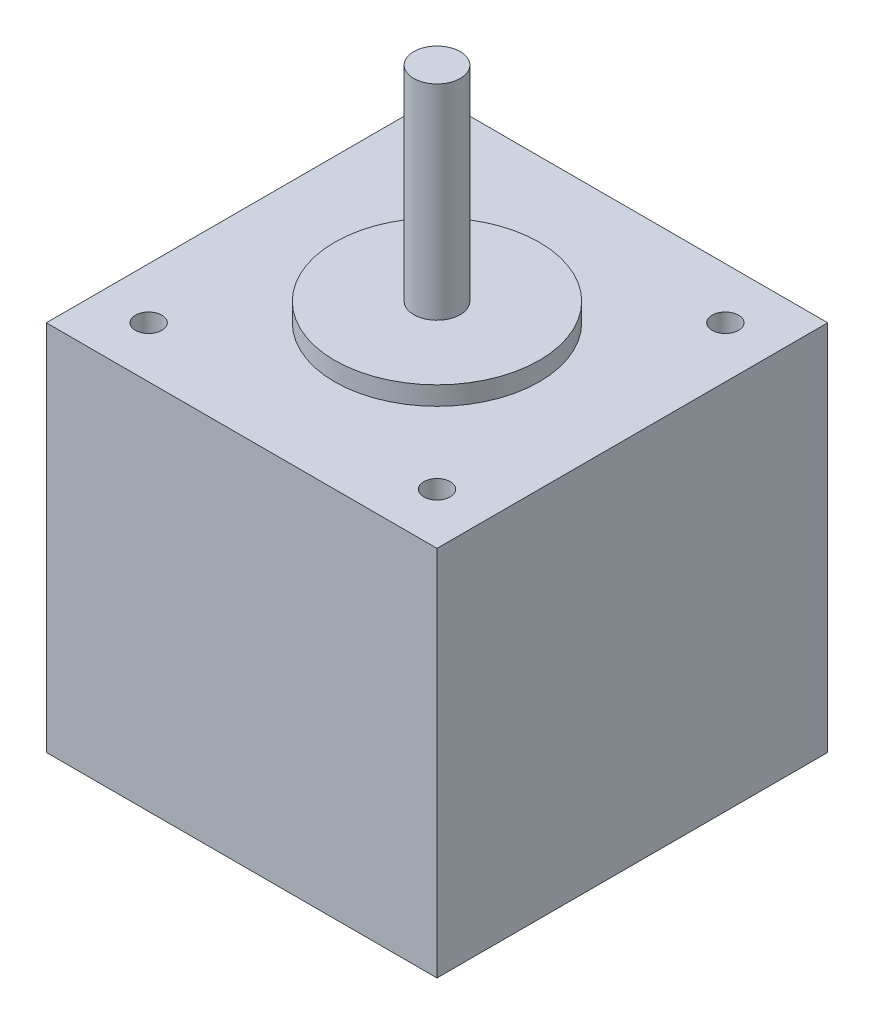
ISO-10303-21;
HEADER;
FILE_DESCRIPTION(('STEP AP214'),'2;1');
FILE_NAME('part.step','',(''),(''),'','','');
FILE_SCHEMA(('AUTOMOTIVE_DESIGN { 1 0 10303 214 1 1 1 1 }'));
ENDSEC;
DATA;
#1=APPLICATION_CONTEXT('core data for automotive mechanical design processes');
#2=APPLICATION_PROTOCOL_DEFINITION('international standard','automotive_design',2000,#1);
#3=PRODUCT_CONTEXT('',#1,'mechanical');
#4=PRODUCT('Part','Part','',(#3));
#5=PRODUCT_RELATED_PRODUCT_CATEGORY('part','',(#4));
#6=PRODUCT_DEFINITION_FORMATION('','',#4);
#7=PRODUCT_DEFINITION_CONTEXT('part definition',#1,'design');
#8=PRODUCT_DEFINITION('design','',#6,#7);
#9=PRODUCT_DEFINITION_SHAPE('','',#8);
#10=(LENGTH_UNIT() NAMED_UNIT(*) SI_UNIT(.MILLI.,.METRE.));
#11=(NAMED_UNIT(*) PLANE_ANGLE_UNIT() SI_UNIT($,.RADIAN.));
#12=(NAMED_UNIT(*) SI_UNIT($,.STERADIAN.) SOLID_ANGLE_UNIT());
#13=UNCERTAINTY_MEASURE_WITH_UNIT(LENGTH_MEASURE(1.E-05),#10,'distance_accuracy_value','');
#14=(GEOMETRIC_REPRESENTATION_CONTEXT(3) GLOBAL_UNCERTAINTY_ASSIGNED_CONTEXT((#13)) GLOBAL_UNIT_ASSIGNED_CONTEXT((#10,
#11,#12)) REPRESENTATION_CONTEXT('',''));
#15=CARTESIAN_POINT('',(0.,0.,0.));
#16=DIRECTION('',(0.,0.,1.));
#17=DIRECTION('',(1.,0.,0.));
#18=AXIS2_PLACEMENT_3D('',#15,#16,#17);
#19=CARTESIAN_POINT('',(21.,40.,21.));
#20=DIRECTION('',(-1.,0.,0.));
#21=DIRECTION('',(0.,0.,1.));
#22=AXIS2_PLACEMENT_3D('',#19,#20,#21);
#23=PLANE('',#22);
#24=DIRECTION('',(0.,0.,-1.));
#25=VECTOR('',#24,1.);
#26=CARTESIAN_POINT('',(21.,0.,21.));
#27=LINE('',#26,#25);
#28=CARTESIAN_POINT('',(21.,0.,21.));
#29=VERTEX_POINT('',#28);
#30=CARTESIAN_POINT('',(21.,0.,-21.));
#31=VERTEX_POINT('',#30);
#32=EDGE_CURVE('E102',#29,#31,#27,.T.);
#33=ORIENTED_EDGE('',*,*,#32,.T.);
#34=DIRECTION('',(0.,-1.,0.));
#35=VECTOR('',#34,1.);
#36=CARTESIAN_POINT('',(21.,40.,-21.));
#37=LINE('',#36,#35);
#38=CARTESIAN_POINT('',(21.,40.,-21.));
#39=VERTEX_POINT('',#38);
#40=EDGE_CURVE('E44',#39,#31,#37,.T.);
#41=ORIENTED_EDGE('',*,*,#40,.F.);
#42=DIRECTION('',(0.,0.,-1.));
#43=VECTOR('',#42,1.);
#44=CARTESIAN_POINT('',(21.,40.,21.));
#45=LINE('',#44,#43);
#46=CARTESIAN_POINT('',(21.,40.,21.));
#47=VERTEX_POINT('',#46);
#48=EDGE_CURVE('E88',#47,#39,#45,.T.);
#49=ORIENTED_EDGE('',*,*,#48,.F.);
#50=DIRECTION('',(0.,-1.,0.));
#51=VECTOR('',#50,1.);
#52=CARTESIAN_POINT('',(21.,40.,21.));
#53=LINE('',#52,#51);
#54=EDGE_CURVE('E98',#47,#29,#53,.T.);
#55=ORIENTED_EDGE('',*,*,#54,.T.);
#56=EDGE_LOOP('',(#33,#41,#49,#55));
#57=FACE_BOUND('',#56,.T.);
#58=ADVANCED_FACE('F36',(#57),#23,.F.);
#59=CARTESIAN_POINT('',(-21.,40.,-21.));
#60=DIRECTION('',(0.,0.,1.));
#61=DIRECTION('',(1.,0.,0.));
#62=AXIS2_PLACEMENT_3D('',#59,#60,#61);
#63=PLANE('',#62);
#64=DIRECTION('',(-1.,0.,0.));
#65=VECTOR('',#64,1.);
#66=CARTESIAN_POINT('',(-21.,0.,-21.));
#67=LINE('',#66,#65);
#68=CARTESIAN_POINT('',(-21.,0.,-21.));
#69=VERTEX_POINT('',#68);
#70=EDGE_CURVE('E93',#31,#69,#67,.T.);
#71=ORIENTED_EDGE('',*,*,#70,.T.);
#72=DIRECTION('',(0.,-1.,0.));
#73=VECTOR('',#72,1.);
#74=CARTESIAN_POINT('',(-21.,40.,-21.));
#75=LINE('',#74,#73);
#76=CARTESIAN_POINT('',(-21.,40.,-21.));
#77=VERTEX_POINT('',#76);
#78=EDGE_CURVE('E91',#77,#69,#75,.T.);
#79=ORIENTED_EDGE('',*,*,#78,.F.);
#80=DIRECTION('',(-1.,0.,0.));
#81=VECTOR('',#80,1.);
#82=CARTESIAN_POINT('',(-21.,40.,-21.));
#83=LINE('',#82,#81);
#84=EDGE_CURVE('E83',#39,#77,#83,.T.);
#85=ORIENTED_EDGE('',*,*,#84,.F.);
#86=ORIENTED_EDGE('',*,*,#40,.T.);
#87=EDGE_LOOP('',(#71,#79,#85,#86));
#88=FACE_BOUND('',#87,.T.);
#89=ADVANCED_FACE('F92',(#88),#63,.F.);
#90=CARTESIAN_POINT('',(-21.,40.,21.));
#91=DIRECTION('',(1.,0.,0.));
#92=DIRECTION('',(0.,0.,-1.));
#93=AXIS2_PLACEMENT_3D('',#90,#91,#92);
#94=PLANE('',#93);
#95=DIRECTION('',(0.,0.,1.));
#96=VECTOR('',#95,1.);
#97=CARTESIAN_POINT('',(-21.,0.,21.));
#98=LINE('',#97,#96);
#99=CARTESIAN_POINT('',(-21.,0.,21.));
#100=VERTEX_POINT('',#99);
#101=EDGE_CURVE('E69',#69,#100,#98,.T.);
#102=ORIENTED_EDGE('',*,*,#101,.T.);
#103=DIRECTION('',(0.,-1.,0.));
#104=VECTOR('',#103,1.);
#105=CARTESIAN_POINT('',(-21.,40.,21.));
#106=LINE('',#105,#104);
#107=CARTESIAN_POINT('',(-21.,40.,21.));
#108=VERTEX_POINT('',#107);
#109=EDGE_CURVE('E94',#108,#100,#106,.T.);
#110=ORIENTED_EDGE('',*,*,#109,.F.);
#111=DIRECTION('',(0.,0.,1.));
#112=VECTOR('',#111,1.);
#113=CARTESIAN_POINT('',(-21.,40.,21.));
#114=LINE('',#113,#112);
#115=EDGE_CURVE('E86',#77,#108,#114,.T.);
#116=ORIENTED_EDGE('',*,*,#115,.F.);
#117=ORIENTED_EDGE('',*,*,#78,.T.);
#118=EDGE_LOOP('',(#102,#110,#116,#117));
#119=FACE_BOUND('',#118,.T.);
#120=ADVANCED_FACE('F96',(#119),#94,.F.);
#121=CARTESIAN_POINT('',(-21.,40.,21.));
#122=DIRECTION('',(0.,0.,-1.));
#123=DIRECTION('',(-1.,0.,0.));
#124=AXIS2_PLACEMENT_3D('',#121,#122,#123);
#125=PLANE('',#124);
#126=DIRECTION('',(1.,0.,0.));
#127=VECTOR('',#126,1.);
#128=CARTESIAN_POINT('',(-21.,0.,21.));
#129=LINE('',#128,#127);
#130=EDGE_CURVE('E75',#100,#29,#129,.T.);
#131=ORIENTED_EDGE('',*,*,#130,.T.);
#132=ORIENTED_EDGE('',*,*,#54,.F.);
#133=DIRECTION('',(1.,0.,0.));
#134=VECTOR('',#133,1.);
#135=CARTESIAN_POINT('',(-21.,40.,21.));
#136=LINE('',#135,#134);
#137=EDGE_CURVE('E52',#108,#47,#136,.T.);
#138=ORIENTED_EDGE('',*,*,#137,.F.);
#139=ORIENTED_EDGE('',*,*,#109,.T.);
#140=EDGE_LOOP('',(#131,#132,#138,#139));
#141=FACE_BOUND('',#140,.T.);
#142=ADVANCED_FACE('F124',(#141),#125,.F.);
#143=CARTESIAN_POINT('',(0.,40.,0.));
#144=DIRECTION('',(0.,-1.,0.));
#145=DIRECTION('',(0.,0.,-1.));
#146=AXIS2_PLACEMENT_3D('',#143,#144,#145);
#147=PLANE('',#146);
#148=CARTESIAN_POINT('',(15.5,40.,-15.5));
#149=DIRECTION('',(0.,1.,0.));
#150=DIRECTION('',(0.,0.,1.));
#151=AXIS2_PLACEMENT_3D('',#148,#149,#150);
#152=CIRCLE('',#151,1.42);
#153=CARTESIAN_POINT('',(15.5,40.,-14.08));
#154=VERTEX_POINT('',#153);
#155=EDGE_CURVE('E279',#154,#154,#152,.T.);
#156=ORIENTED_EDGE('',*,*,#155,.F.);
#157=EDGE_LOOP('',(#156));
#158=FACE_BOUND('',#157,.T.);
#159=CARTESIAN_POINT('',(15.5000000000003,40.,15.5));
#160=DIRECTION('',(0.,1.,0.));
#161=DIRECTION('',(0.,0.,1.));
#162=AXIS2_PLACEMENT_3D('',#159,#160,#161);
#163=CIRCLE('',#162,1.42);
#164=CARTESIAN_POINT('',(15.5000000000003,40.,16.92));
#165=VERTEX_POINT('',#164);
#166=EDGE_CURVE('E273',#165,#165,#163,.T.);
#167=ORIENTED_EDGE('',*,*,#166,.F.);
#168=EDGE_LOOP('',(#167));
#169=FACE_BOUND('',#168,.T.);
#170=CARTESIAN_POINT('',(-15.4999999999997,40.,15.5));
#171=DIRECTION('',(0.,1.,0.));
#172=DIRECTION('',(0.,0.,1.));
#173=AXIS2_PLACEMENT_3D('',#170,#171,#172);
#174=CIRCLE('',#173,1.42);
#175=CARTESIAN_POINT('',(-15.4999999999997,40.,16.92));
#176=VERTEX_POINT('',#175);
#177=EDGE_CURVE('E267',#176,#176,#174,.T.);
#178=ORIENTED_EDGE('',*,*,#177,.F.);
#179=EDGE_LOOP('',(#178));
#180=FACE_BOUND('',#179,.T.);
#181=CARTESIAN_POINT('',(-15.5,40.,-15.5));
#182=DIRECTION('',(0.,1.,0.));
#183=DIRECTION('',(0.,0.,1.));
#184=AXIS2_PLACEMENT_3D('',#181,#182,#183);
#185=CIRCLE('',#184,1.42);
#186=CARTESIAN_POINT('',(-15.5,40.,-14.08));
#187=VERTEX_POINT('',#186);
#188=EDGE_CURVE('E261',#187,#187,#185,.T.);
#189=ORIENTED_EDGE('',*,*,#188,.F.);
#190=EDGE_LOOP('',(#189));
#191=FACE_BOUND('',#190,.T.);
#192=CARTESIAN_POINT('',(0.,40.,0.));
#193=DIRECTION('',(0.,-1.,0.));
#194=DIRECTION('',(0.,0.,-1.));
#195=AXIS2_PLACEMENT_3D('',#192,#193,#194);
#196=CIRCLE('',#195,11.);
#197=CARTESIAN_POINT('',(0.,40.,-11.));
#198=VERTEX_POINT('',#197);
#199=EDGE_CURVE('E11',#198,#198,#196,.F.);
#200=ORIENTED_EDGE('',*,*,#199,.F.);
#201=EDGE_LOOP('',(#200));
#202=FACE_BOUND('',#201,.T.);
#203=ORIENTED_EDGE('',*,*,#48,.T.);
#204=ORIENTED_EDGE('',*,*,#84,.T.);
#205=ORIENTED_EDGE('',*,*,#115,.T.);
#206=ORIENTED_EDGE('',*,*,#137,.T.);
#207=EDGE_LOOP('',(#203,#204,#205,#206));
#208=FACE_BOUND('',#207,.T.);
#209=ADVANCED_FACE('F84',(#158,#169,#180,#191,#202,#208),#147,.F.);
#210=CARTESIAN_POINT('',(0.,0.,0.));
#211=DIRECTION('',(0.,-1.,0.));
#212=DIRECTION('',(0.,0.,-1.));
#213=AXIS2_PLACEMENT_3D('',#210,#211,#212);
#214=PLANE('',#213);
#215=ORIENTED_EDGE('',*,*,#32,.F.);
#216=ORIENTED_EDGE('',*,*,#130,.F.);
#217=ORIENTED_EDGE('',*,*,#101,.F.);
#218=ORIENTED_EDGE('',*,*,#70,.F.);
#219=EDGE_LOOP('',(#215,#216,#217,#218));
#220=FACE_BOUND('',#219,.T.);
#221=ADVANCED_FACE('F113',(#220),#214,.T.);
#222=CARTESIAN_POINT('',(0.,42.,0.));
#223=DIRECTION('',(0.,-1.,0.));
#224=DIRECTION('',(0.,0.,-1.));
#225=AXIS2_PLACEMENT_3D('',#222,#223,#224);
#226=CYLINDRICAL_SURFACE('',#225,11.);
#227=CARTESIAN_POINT('',(0.,42.,0.));
#228=DIRECTION('',(0.,1.,0.));
#229=DIRECTION('',(0.,0.,1.));
#230=AXIS2_PLACEMENT_3D('',#227,#228,#229);
#231=CIRCLE('',#230,11.);
#232=CARTESIAN_POINT('',(0.,42.,11.));
#233=VERTEX_POINT('',#232);
#234=EDGE_CURVE('E105',#233,#233,#231,.T.);
#235=ORIENTED_EDGE('',*,*,#234,.F.);
#236=EDGE_LOOP('',(#235));
#237=FACE_BOUND('',#236,.T.);
#238=ORIENTED_EDGE('',*,*,#199,.T.);
#239=EDGE_LOOP('',(#238));
#240=FACE_BOUND('',#239,.T.);
#241=ADVANCED_FACE('F115',(#237,#240),#226,.T.);
#242=CARTESIAN_POINT('',(0.,42.,0.));
#243=DIRECTION('',(0.,1.,0.));
#244=DIRECTION('',(0.,0.,1.));
#245=AXIS2_PLACEMENT_3D('',#242,#243,#244);
#246=PLANE('',#245);
#247=CARTESIAN_POINT('',(0.,42.,0.));
#248=DIRECTION('',(0.,1.,0.));
#249=DIRECTION('',(0.,0.,1.));
#250=AXIS2_PLACEMENT_3D('',#247,#248,#249);
#251=CIRCLE('',#250,2.5);
#252=CARTESIAN_POINT('',(0.,42.,2.5));
#253=VERTEX_POINT('',#252);
#254=EDGE_CURVE('E251',#253,#253,#251,.T.);
#255=ORIENTED_EDGE('',*,*,#254,.F.);
#256=EDGE_LOOP('',(#255));
#257=FACE_BOUND('',#256,.T.);
#258=ORIENTED_EDGE('',*,*,#234,.T.);
#259=EDGE_LOOP('',(#258));
#260=FACE_BOUND('',#259,.T.);
#261=ADVANCED_FACE('F121',(#257,#260),#246,.T.);
#262=CARTESIAN_POINT('',(0.,64.,0.));
#263=DIRECTION('',(0.,-1.,0.));
#264=DIRECTION('',(0.,0.,-1.));
#265=AXIS2_PLACEMENT_3D('',#262,#263,#264);
#266=CYLINDRICAL_SURFACE('',#265,2.5);
#267=CARTESIAN_POINT('',(0.,64.,0.));
#268=DIRECTION('',(0.,1.,0.));
#269=DIRECTION('',(0.,0.,1.));
#270=AXIS2_PLACEMENT_3D('',#267,#268,#269);
#271=CIRCLE('',#270,2.5);
#272=CARTESIAN_POINT('',(0.,64.,2.5));
#273=VERTEX_POINT('',#272);
#274=EDGE_CURVE('E254',#273,#273,#271,.T.);
#275=ORIENTED_EDGE('',*,*,#274,.F.);
#276=EDGE_LOOP('',(#275));
#277=FACE_BOUND('',#276,.T.);
#278=ORIENTED_EDGE('',*,*,#254,.T.);
#279=EDGE_LOOP('',(#278));
#280=FACE_BOUND('',#279,.T.);
#281=ADVANCED_FACE('F239',(#277,#280),#266,.T.);
#282=CARTESIAN_POINT('',(0.,64.,0.));
#283=DIRECTION('',(0.,1.,0.));
#284=DIRECTION('',(0.,0.,1.));
#285=AXIS2_PLACEMENT_3D('',#282,#283,#284);
#286=PLANE('',#285);
#287=ORIENTED_EDGE('',*,*,#274,.T.);
#288=EDGE_LOOP('',(#287));
#289=FACE_BOUND('',#288,.T.);
#290=ADVANCED_FACE('F152',(#289),#286,.T.);
#291=CARTESIAN_POINT('',(-15.5,35.,-15.5));
#292=DIRECTION('',(0.,1.,0.));
#293=DIRECTION('',(0.,0.,1.));
#294=AXIS2_PLACEMENT_3D('',#291,#292,#293);
#295=CYLINDRICAL_SURFACE('',#294,1.42);
#296=CARTESIAN_POINT('',(-15.5,35.,-15.5));
#297=DIRECTION('',(0.,1.,0.));
#298=DIRECTION('',(0.,0.,1.));
#299=AXIS2_PLACEMENT_3D('',#296,#297,#298);
#300=CIRCLE('',#299,1.42);
#301=CARTESIAN_POINT('',(-15.5,35.,-14.08));
#302=VERTEX_POINT('',#301);
#303=EDGE_CURVE('E259',#302,#302,#300,.T.);
#304=ORIENTED_EDGE('',*,*,#303,.F.);
#305=EDGE_LOOP('',(#304));
#306=FACE_BOUND('',#305,.T.);
#307=ORIENTED_EDGE('',*,*,#188,.T.);
#308=EDGE_LOOP('',(#307));
#309=FACE_BOUND('',#308,.T.);
#310=ADVANCED_FACE('F157',(#306,#309),#295,.F.);
#311=CARTESIAN_POINT('',(-15.5,35.,-15.5));
#312=DIRECTION('',(0.,1.,0.));
#313=DIRECTION('',(0.,0.,1.));
#314=AXIS2_PLACEMENT_3D('',#311,#312,#313);
#315=PLANE('',#314);
#316=ORIENTED_EDGE('',*,*,#303,.T.);
#317=EDGE_LOOP('',(#316));
#318=FACE_BOUND('',#317,.T.);
#319=ADVANCED_FACE('F162',(#318),#315,.T.);
#320=CARTESIAN_POINT('',(-15.4999999999997,35.,15.5));
#321=DIRECTION('',(0.,1.,0.));
#322=DIRECTION('',(0.,0.,1.));
#323=AXIS2_PLACEMENT_3D('',#320,#321,#322);
#324=CYLINDRICAL_SURFACE('',#323,1.42);
#325=CARTESIAN_POINT('',(-15.4999999999997,35.,15.5));
#326=DIRECTION('',(0.,1.,0.));
#327=DIRECTION('',(0.,0.,1.));
#328=AXIS2_PLACEMENT_3D('',#325,#326,#327);
#329=CIRCLE('',#328,1.42);
#330=CARTESIAN_POINT('',(-15.4999999999997,35.,16.92));
#331=VERTEX_POINT('',#330);
#332=EDGE_CURVE('E270',#331,#331,#329,.T.);
#333=ORIENTED_EDGE('',*,*,#332,.F.);
#334=EDGE_LOOP('',(#333));
#335=FACE_BOUND('',#334,.T.);
#336=ORIENTED_EDGE('',*,*,#177,.T.);
#337=EDGE_LOOP('',(#336));
#338=FACE_BOUND('',#337,.T.);
#339=ADVANCED_FACE('F172',(#335,#338),#324,.F.);
#340=CARTESIAN_POINT('',(-15.4999999999997,35.,15.5));
#341=DIRECTION('',(0.,1.,0.));
#342=DIRECTION('',(0.,0.,1.));
#343=AXIS2_PLACEMENT_3D('',#340,#341,#342);
#344=PLANE('',#343);
#345=ORIENTED_EDGE('',*,*,#332,.T.);
#346=EDGE_LOOP('',(#345));
#347=FACE_BOUND('',#346,.T.);
#348=ADVANCED_FACE('F182',(#347),#344,.T.);
#349=CARTESIAN_POINT('',(15.5000000000003,35.,15.5));
#350=DIRECTION('',(0.,1.,0.));
#351=DIRECTION('',(0.,0.,1.));
#352=AXIS2_PLACEMENT_3D('',#349,#350,#351);
#353=CYLINDRICAL_SURFACE('',#352,1.42);
#354=CARTESIAN_POINT('',(15.5000000000003,35.,15.5));
#355=DIRECTION('',(0.,1.,0.));
#356=DIRECTION('',(0.,0.,1.));
#357=AXIS2_PLACEMENT_3D('',#354,#355,#356);
#358=CIRCLE('',#357,1.42);
#359=CARTESIAN_POINT('',(15.5000000000003,35.,16.92));
#360=VERTEX_POINT('',#359);
#361=EDGE_CURVE('E276',#360,#360,#358,.T.);
#362=ORIENTED_EDGE('',*,*,#361,.F.);
#363=EDGE_LOOP('',(#362));
#364=FACE_BOUND('',#363,.T.);
#365=ORIENTED_EDGE('',*,*,#166,.T.);
#366=EDGE_LOOP('',(#365));
#367=FACE_BOUND('',#366,.T.);
#368=ADVANCED_FACE('F192',(#364,#367),#353,.F.);
#369=CARTESIAN_POINT('',(15.5000000000003,35.,15.5));
#370=DIRECTION('',(0.,1.,0.));
#371=DIRECTION('',(0.,0.,1.));
#372=AXIS2_PLACEMENT_3D('',#369,#370,#371);
#373=PLANE('',#372);
#374=ORIENTED_EDGE('',*,*,#361,.T.);
#375=EDGE_LOOP('',(#374));
#376=FACE_BOUND('',#375,.T.);
#377=ADVANCED_FACE('F202',(#376),#373,.T.);
#378=CARTESIAN_POINT('',(15.5,35.,-15.5));
#379=DIRECTION('',(0.,1.,0.));
#380=DIRECTION('',(0.,0.,1.));
#381=AXIS2_PLACEMENT_3D('',#378,#379,#380);
#382=CYLINDRICAL_SURFACE('',#381,1.42);
#383=CARTESIAN_POINT('',(15.5,35.,-15.5));
#384=DIRECTION('',(0.,1.,0.));
#385=DIRECTION('',(0.,0.,1.));
#386=AXIS2_PLACEMENT_3D('',#383,#384,#385);
#387=CIRCLE('',#386,1.42);
#388=CARTESIAN_POINT('',(15.5,35.,-14.08));
#389=VERTEX_POINT('',#388);
#390=EDGE_CURVE('E264',#389,#389,#387,.T.);
#391=ORIENTED_EDGE('',*,*,#390,.F.);
#392=EDGE_LOOP('',(#391));
#393=FACE_BOUND('',#392,.T.);
#394=ORIENTED_EDGE('',*,*,#155,.T.);
#395=EDGE_LOOP('',(#394));
#396=FACE_BOUND('',#395,.T.);
#397=ADVANCED_FACE('F212',(#393,#396),#382,.F.);
#398=CARTESIAN_POINT('',(15.5,35.,-15.5));
#399=DIRECTION('',(0.,1.,0.));
#400=DIRECTION('',(0.,0.,1.));
#401=AXIS2_PLACEMENT_3D('',#398,#399,#400);
#402=PLANE('',#401);
#403=ORIENTED_EDGE('',*,*,#390,.T.);
#404=EDGE_LOOP('',(#403));
#405=FACE_BOUND('',#404,.T.);
#406=ADVANCED_FACE('F222',(#405),#402,.T.);
#407=CLOSED_SHELL('',(#58,#89,#120,#142,#209,#221,#241,#261,#281,#290,#310,#319,#339,#348,#368,
#377,#397,#406));
#408=MANIFOLD_SOLID_BREP('B2',#407);
#409=ADVANCED_BREP_SHAPE_REPRESENTATION('',(#18,#408),#14);
#410=SHAPE_DEFINITION_REPRESENTATION(#9,#409);
ENDSEC;
END-ISO-10303-21;
